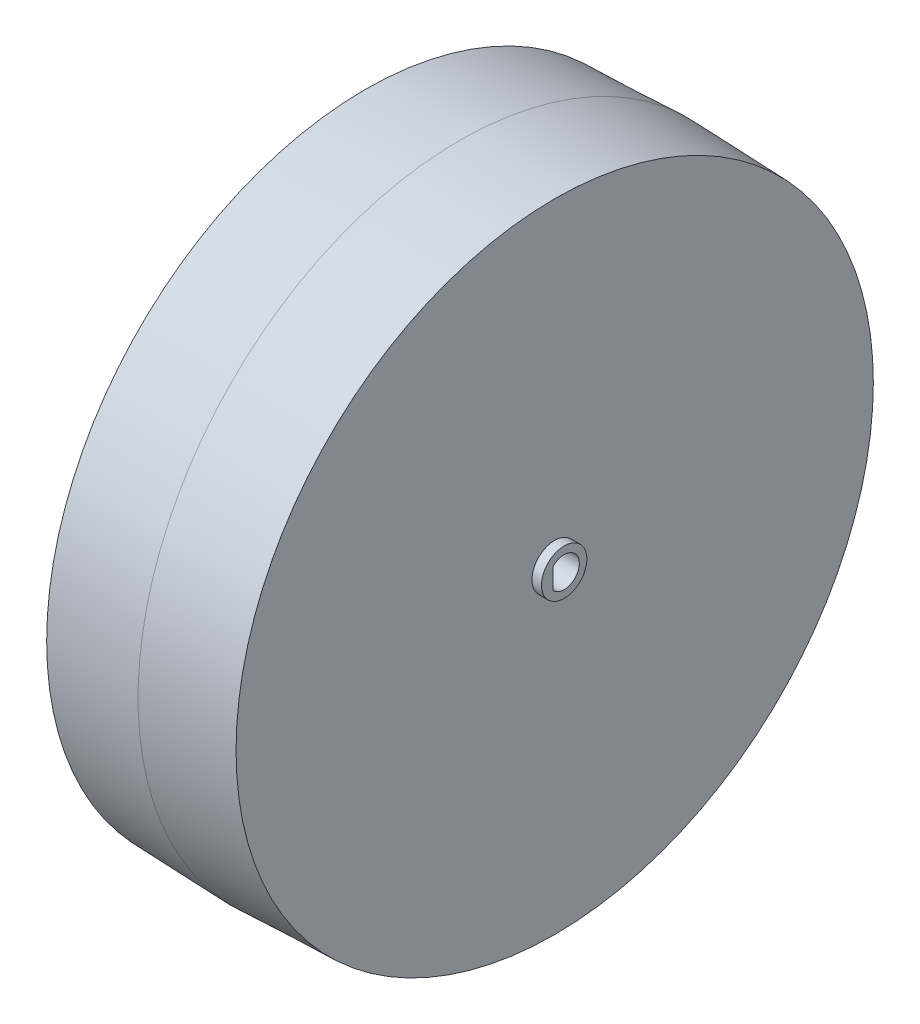
ISO-10303-21;
HEADER;
FILE_DESCRIPTION(('STEP AP214'),'2;1');
FILE_NAME('part.step','',(''),(''),'','','');
FILE_SCHEMA(('AUTOMOTIVE_DESIGN { 1 0 10303 214 1 1 1 1 }'));
ENDSEC;
DATA;
#1=APPLICATION_CONTEXT('core data for automotive mechanical design processes');
#2=APPLICATION_PROTOCOL_DEFINITION('international standard','automotive_design',2000,#1);
#3=PRODUCT_CONTEXT('',#1,'mechanical');
#4=PRODUCT('Part','Part','',(#3));
#5=PRODUCT_RELATED_PRODUCT_CATEGORY('part','',(#4));
#6=PRODUCT_DEFINITION_FORMATION('','',#4);
#7=PRODUCT_DEFINITION_CONTEXT('part definition',#1,'design');
#8=PRODUCT_DEFINITION('design','',#6,#7);
#9=PRODUCT_DEFINITION_SHAPE('','',#8);
#10=(LENGTH_UNIT() NAMED_UNIT(*) SI_UNIT(.MILLI.,.METRE.));
#11=(NAMED_UNIT(*) PLANE_ANGLE_UNIT() SI_UNIT($,.RADIAN.));
#12=(NAMED_UNIT(*) SI_UNIT($,.STERADIAN.) SOLID_ANGLE_UNIT());
#13=UNCERTAINTY_MEASURE_WITH_UNIT(LENGTH_MEASURE(1.E-05),#10,'distance_accuracy_value','');
#14=(GEOMETRIC_REPRESENTATION_CONTEXT(3) GLOBAL_UNCERTAINTY_ASSIGNED_CONTEXT((#13)) GLOBAL_UNIT_ASSIGNED_CONTEXT((#10,
#11,#12)) REPRESENTATION_CONTEXT('',''));
#15=CARTESIAN_POINT('',(0.,0.,0.));
#16=DIRECTION('',(0.,0.,1.));
#17=DIRECTION('',(1.,0.,0.));
#18=AXIS2_PLACEMENT_3D('',#15,#16,#17);
#19=CARTESIAN_POINT('',(0.,0.,0.));
#20=DIRECTION('',(1.,0.,0.));
#21=DIRECTION('',(0.,0.,-1.));
#22=AXIS2_PLACEMENT_3D('',#19,#20,#21);
#23=CONICAL_SURFACE('',#22,85.,0.0349065850398867);
#24=CARTESIAN_POINT('',(-25.,0.,0.));
#25=DIRECTION('',(1.,0.,0.));
#26=DIRECTION('',(0.,0.,-1.));
#27=AXIS2_PLACEMENT_3D('',#24,#25,#26);
#28=CIRCLE('',#27,84.1269807627063);
#29=CARTESIAN_POINT('',(-25.,0.,-84.1269807627063));
#30=VERTEX_POINT('',#29);
#31=EDGE_CURVE('E11',#30,#30,#28,.T.);
#32=ORIENTED_EDGE('',*,*,#31,.T.);
#33=EDGE_LOOP('',(#32));
#34=FACE_BOUND('',#33,.T.);
#35=CARTESIAN_POINT('',(0.,0.,0.));
#36=DIRECTION('',(1.,0.,0.));
#37=DIRECTION('',(0.,0.,-1.));
#38=AXIS2_PLACEMENT_3D('',#35,#36,#37);
#39=CIRCLE('',#38,85.);
#40=CARTESIAN_POINT('',(0.,0.,-85.));
#41=VERTEX_POINT('',#40);
#42=EDGE_CURVE('E43',#41,#41,#39,.T.);
#43=ORIENTED_EDGE('',*,*,#42,.F.);
#44=EDGE_LOOP('',(#43));
#45=FACE_BOUND('',#44,.T.);
#46=ADVANCED_FACE('F36',(#34,#45),#23,.T.);
#47=CARTESIAN_POINT('',(-25.,0.,0.));
#48=DIRECTION('',(1.,0.,0.));
#49=DIRECTION('',(0.,0.,-1.));
#50=AXIS2_PLACEMENT_3D('',#47,#48,#49);
#51=PLANE('',#50);
#52=ORIENTED_EDGE('',*,*,#31,.F.);
#53=EDGE_LOOP('',(#52));
#54=FACE_BOUND('',#53,.T.);
#55=ADVANCED_FACE('F95',(#54),#51,.F.);
#56=CARTESIAN_POINT('',(0.,0.,0.));
#57=DIRECTION('',(-1.,0.,0.));
#58=DIRECTION('',(0.,0.,-1.));
#59=AXIS2_PLACEMENT_3D('',#56,#57,#58);
#60=CONICAL_SURFACE('',#59,85.,0.0349065850398867);
#61=CARTESIAN_POINT('',(25.,0.,0.));
#62=DIRECTION('',(1.,0.,0.));
#63=DIRECTION('',(0.,0.,-1.));
#64=AXIS2_PLACEMENT_3D('',#61,#62,#63);
#65=CIRCLE('',#64,84.1269807627063);
#66=CARTESIAN_POINT('',(25.,0.,-84.1269807627063));
#67=VERTEX_POINT('',#66);
#68=EDGE_CURVE('E85',#67,#67,#65,.T.);
#69=ORIENTED_EDGE('',*,*,#68,.F.);
#70=EDGE_LOOP('',(#69));
#71=FACE_BOUND('',#70,.T.);
#72=ORIENTED_EDGE('',*,*,#42,.T.);
#73=EDGE_LOOP('',(#72));
#74=FACE_BOUND('',#73,.T.);
#75=ADVANCED_FACE('F92',(#71,#74),#60,.T.);
#76=CARTESIAN_POINT('',(25.,0.,0.));
#77=DIRECTION('',(1.,0.,0.));
#78=DIRECTION('',(0.,0.,-1.));
#79=AXIS2_PLACEMENT_3D('',#76,#77,#78);
#80=PLANE('',#79);
#81=CARTESIAN_POINT('',(25.,0.,0.));
#82=DIRECTION('',(1.,0.,0.));
#83=DIRECTION('',(0.,0.,-1.));
#84=AXIS2_PLACEMENT_3D('',#81,#82,#83);
#85=CIRCLE('',#84,6.);
#86=CARTESIAN_POINT('',(25.,0.,-6.));
#87=VERTEX_POINT('',#86);
#88=EDGE_CURVE('E66',#87,#87,#85,.T.);
#89=ORIENTED_EDGE('',*,*,#88,.F.);
#90=EDGE_LOOP('',(#89));
#91=FACE_BOUND('',#90,.T.);
#92=ORIENTED_EDGE('',*,*,#68,.T.);
#93=EDGE_LOOP('',(#92));
#94=FACE_BOUND('',#93,.T.);
#95=ADVANCED_FACE('F105',(#91,#94),#80,.T.);
#96=CARTESIAN_POINT('',(27.5,0.,0.));
#97=DIRECTION('',(-1.,0.,0.));
#98=DIRECTION('',(0.,0.,1.));
#99=AXIS2_PLACEMENT_3D('',#96,#97,#98);
#100=CYLINDRICAL_SURFACE('',#99,6.);
#101=CARTESIAN_POINT('',(27.5,0.,0.));
#102=DIRECTION('',(1.,0.,0.));
#103=DIRECTION('',(0.,0.,-1.));
#104=AXIS2_PLACEMENT_3D('',#101,#102,#103);
#105=CIRCLE('',#104,6.);
#106=CARTESIAN_POINT('',(27.5,0.,-6.));
#107=VERTEX_POINT('',#106);
#108=EDGE_CURVE('E82',#107,#107,#105,.T.);
#109=ORIENTED_EDGE('',*,*,#108,.F.);
#110=EDGE_LOOP('',(#109));
#111=FACE_BOUND('',#110,.T.);
#112=ORIENTED_EDGE('',*,*,#88,.T.);
#113=EDGE_LOOP('',(#112));
#114=FACE_BOUND('',#113,.T.);
#115=ADVANCED_FACE('F111',(#111,#114),#100,.T.);
#116=CARTESIAN_POINT('',(27.5,0.,0.));
#117=DIRECTION('',(1.,0.,0.));
#118=DIRECTION('',(0.,0.,-1.));
#119=AXIS2_PLACEMENT_3D('',#116,#117,#118);
#120=PLANE('',#119);
#121=CARTESIAN_POINT('',(27.5,0.,0.));
#122=DIRECTION('',(1.,0.,0.));
#123=DIRECTION('',(0.,0.,-1.));
#124=AXIS2_PLACEMENT_3D('',#121,#122,#123);
#125=CIRCLE('',#124,4.);
#126=CARTESIAN_POINT('',(27.5,-2.64575131106459,3.));
#127=VERTEX_POINT('',#126);
#128=CARTESIAN_POINT('',(27.5,2.64575131106459,3.));
#129=VERTEX_POINT('',#128);
#130=EDGE_CURVE('E50',#127,#129,#125,.T.);
#131=ORIENTED_EDGE('',*,*,#130,.F.);
#132=DIRECTION('',(0.,-1.,0.));
#133=VECTOR('',#132,1.);
#134=CARTESIAN_POINT('',(27.5,-2.64575131106459,3.));
#135=LINE('',#134,#133);
#136=EDGE_CURVE('E70',#129,#127,#135,.T.);
#137=ORIENTED_EDGE('',*,*,#136,.F.);
#138=EDGE_LOOP('',(#131,#137));
#139=FACE_BOUND('',#138,.T.);
#140=ORIENTED_EDGE('',*,*,#108,.T.);
#141=EDGE_LOOP('',(#140));
#142=FACE_BOUND('',#141,.T.);
#143=ADVANCED_FACE('F74',(#139,#142),#120,.T.);
#144=CARTESIAN_POINT('',(13.5,0.,0.));
#145=DIRECTION('',(1.,0.,0.));
#146=DIRECTION('',(0.,0.,-1.));
#147=AXIS2_PLACEMENT_3D('',#144,#145,#146);
#148=CYLINDRICAL_SURFACE('',#147,4.);
#149=ORIENTED_EDGE('',*,*,#130,.T.);
#150=DIRECTION('',(1.,0.,0.));
#151=VECTOR('',#150,1.);
#152=CARTESIAN_POINT('',(13.5,2.64575131106459,3.));
#153=LINE('',#152,#151);
#154=CARTESIAN_POINT('',(13.5,2.64575131106459,3.));
#155=VERTEX_POINT('',#154);
#156=EDGE_CURVE('E67',#155,#129,#153,.T.);
#157=ORIENTED_EDGE('',*,*,#156,.F.);
#158=CARTESIAN_POINT('',(13.5,0.,0.));
#159=DIRECTION('',(1.,0.,0.));
#160=DIRECTION('',(0.,0.,-1.));
#161=AXIS2_PLACEMENT_3D('',#158,#159,#160);
#162=CIRCLE('',#161,4.);
#163=CARTESIAN_POINT('',(13.5,-2.64575131106459,3.));
#164=VERTEX_POINT('',#163);
#165=EDGE_CURVE('E64',#164,#155,#162,.T.);
#166=ORIENTED_EDGE('',*,*,#165,.F.);
#167=DIRECTION('',(1.,0.,0.));
#168=VECTOR('',#167,1.);
#169=CARTESIAN_POINT('',(13.5,-2.64575131106459,3.));
#170=LINE('',#169,#168);
#171=EDGE_CURVE('E58',#164,#127,#170,.T.);
#172=ORIENTED_EDGE('',*,*,#171,.T.);
#173=EDGE_LOOP('',(#149,#157,#166,#172));
#174=FACE_BOUND('',#173,.T.);
#175=ADVANCED_FACE('F62',(#174),#148,.F.);
#176=CARTESIAN_POINT('',(13.5,-2.64575131106459,3.));
#177=DIRECTION('',(0.,0.,1.));
#178=DIRECTION('',(1.,0.,0.));
#179=AXIS2_PLACEMENT_3D('',#176,#177,#178);
#180=PLANE('',#179);
#181=ORIENTED_EDGE('',*,*,#136,.T.);
#182=ORIENTED_EDGE('',*,*,#171,.F.);
#183=DIRECTION('',(0.,-1.,0.));
#184=VECTOR('',#183,1.);
#185=CARTESIAN_POINT('',(13.5,-2.64575131106459,3.));
#186=LINE('',#185,#184);
#187=EDGE_CURVE('E78',#155,#164,#186,.T.);
#188=ORIENTED_EDGE('',*,*,#187,.F.);
#189=ORIENTED_EDGE('',*,*,#156,.T.);
#190=EDGE_LOOP('',(#181,#182,#188,#189));
#191=FACE_BOUND('',#190,.T.);
#192=ADVANCED_FACE('F71',(#191),#180,.F.);
#193=CARTESIAN_POINT('',(13.5,0.,0.));
#194=DIRECTION('',(1.,0.,0.));
#195=DIRECTION('',(0.,0.,-1.));
#196=AXIS2_PLACEMENT_3D('',#193,#194,#195);
#197=PLANE('',#196);
#198=ORIENTED_EDGE('',*,*,#165,.T.);
#199=ORIENTED_EDGE('',*,*,#187,.T.);
#200=EDGE_LOOP('',(#198,#199));
#201=FACE_BOUND('',#200,.T.);
#202=ADVANCED_FACE('F122',(#201),#197,.T.);
#203=CLOSED_SHELL('',(#46,#55,#75,#95,#115,#143,#175,#192,#202));
#204=MANIFOLD_SOLID_BREP('B2',#203);
#205=ADVANCED_BREP_SHAPE_REPRESENTATION('',(#18,#204),#14);
#206=SHAPE_DEFINITION_REPRESENTATION(#9,#205);
ENDSEC;
END-ISO-10303-21;
